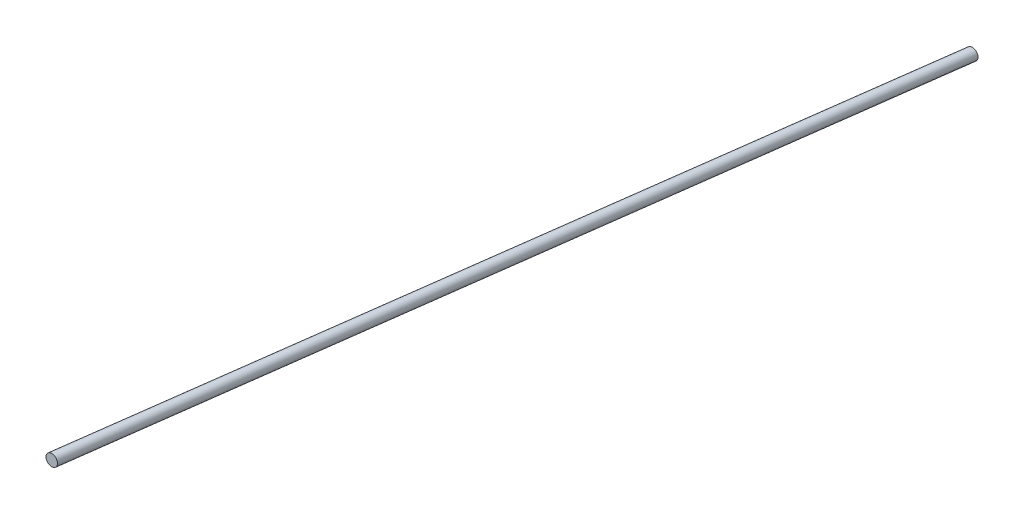
ISO-10303-21;
HEADER;
FILE_DESCRIPTION(('STEP AP214'),'2;1');
FILE_NAME('part.step','',(''),(''),'','','');
FILE_SCHEMA(('AUTOMOTIVE_DESIGN { 1 0 10303 214 1 1 1 1 }'));
ENDSEC;
DATA;
#1=APPLICATION_CONTEXT('core data for automotive mechanical design processes');
#2=APPLICATION_PROTOCOL_DEFINITION('international standard','automotive_design',2000,#1);
#3=PRODUCT_CONTEXT('',#1,'mechanical');
#4=PRODUCT('Part','Part','',(#3));
#5=PRODUCT_RELATED_PRODUCT_CATEGORY('part','',(#4));
#6=PRODUCT_DEFINITION_FORMATION('','',#4);
#7=PRODUCT_DEFINITION_CONTEXT('part definition',#1,'design');
#8=PRODUCT_DEFINITION('design','',#6,#7);
#9=PRODUCT_DEFINITION_SHAPE('','',#8);
#10=(LENGTH_UNIT() NAMED_UNIT(*) SI_UNIT(.MILLI.,.METRE.));
#11=(NAMED_UNIT(*) PLANE_ANGLE_UNIT() SI_UNIT($,.RADIAN.));
#12=(NAMED_UNIT(*) SI_UNIT($,.STERADIAN.) SOLID_ANGLE_UNIT());
#13=UNCERTAINTY_MEASURE_WITH_UNIT(LENGTH_MEASURE(1.E-05),#10,'distance_accuracy_value','');
#14=(GEOMETRIC_REPRESENTATION_CONTEXT(3) GLOBAL_UNCERTAINTY_ASSIGNED_CONTEXT((#13)) GLOBAL_UNIT_ASSIGNED_CONTEXT((#10,
#11,#12)) REPRESENTATION_CONTEXT('',''));
#15=CARTESIAN_POINT('',(0.,0.,0.));
#16=DIRECTION('',(0.,0.,1.));
#17=DIRECTION('',(1.,0.,0.));
#18=AXIS2_PLACEMENT_3D('',#15,#16,#17);
#19=CARTESIAN_POINT('',(19.1,2.1,0.));
#20=DIRECTION('',(0.,0.,-1.));
#21=DIRECTION('',(1.,0.,0.));
#22=AXIS2_PLACEMENT_3D('',#19,#20,#21);
#23=PLANE('',#22);
#24=CARTESIAN_POINT('',(19.1,2.1,0.));
#25=DIRECTION('',(0.,0.,1.));
#26=DIRECTION('',(1.,0.,0.));
#27=AXIS2_PLACEMENT_3D('',#24,#25,#26);
#28=CIRCLE('',#27,4.);
#29=CARTESIAN_POINT('',(23.1,2.1,0.));
#30=VERTEX_POINT('',#29);
#31=EDGE_CURVE('E45',#30,#30,#28,.T.);
#32=ORIENTED_EDGE('',*,*,#31,.T.);
#33=EDGE_LOOP('',(#32));
#34=FACE_BOUND('',#33,.T.);
#35=ADVANCED_FACE('F39',(#34),#23,.F.);
#36=CARTESIAN_POINT('',(94.5402780398458,2.1,-564.985632073304));
#37=DIRECTION('',(0.,0.,-1.));
#38=DIRECTION('',(1.,0.,0.));
#39=AXIS2_PLACEMENT_3D('',#36,#37,#38);
#40=PLANE('',#39);
#41=CARTESIAN_POINT('',(94.5402780398458,2.1,-564.985632073304));
#42=DIRECTION('',(0.,0.,1.));
#43=DIRECTION('',(1.,0.,0.));
#44=AXIS2_PLACEMENT_3D('',#41,#42,#43);
#45=CIRCLE('',#44,4.);
#46=CARTESIAN_POINT('',(98.5402780398458,2.1,-564.985632073304));
#47=VERTEX_POINT('',#46);
#48=EDGE_CURVE('E10',#47,#47,#45,.T.);
#49=ORIENTED_EDGE('',*,*,#48,.F.);
#50=EDGE_LOOP('',(#49));
#51=FACE_BOUND('',#50,.T.);
#52=ADVANCED_FACE('F54',(#51),#40,.T.);
#53=CARTESIAN_POINT('',(23.1,2.1,0.));
#54=CARTESIAN_POINT('',(98.5402780398458,2.1,-564.985632073304));
#55=CARTESIAN_POINT('',(23.1,10.1,0.));
#56=CARTESIAN_POINT('',(98.5402780398458,10.1,-564.985632073304));
#57=CARTESIAN_POINT('',(15.1,10.1,0.));
#58=CARTESIAN_POINT('',(90.5402780398458,10.1,-564.985632073304));
#59=CARTESIAN_POINT('',(15.1,2.1,0.));
#60=CARTESIAN_POINT('',(90.5402780398458,2.1,-564.985632073304));
#61=CARTESIAN_POINT('',(15.1,-5.9,0.));
#62=CARTESIAN_POINT('',(90.5402780398458,-5.9,-564.985632073304));
#63=CARTESIAN_POINT('',(23.1,-5.9,0.));
#64=CARTESIAN_POINT('',(98.5402780398458,-5.9,-564.985632073304));
#65=CARTESIAN_POINT('',(23.1,2.1,0.));
#66=CARTESIAN_POINT('',(98.5402780398458,2.1,-564.985632073304));
#67=(BOUNDED_SURFACE() B_SPLINE_SURFACE(3,1,((#53,#54),(#55,#56),(#57,#58),(#59,#60),(#61,#62),
(#63,#64),(#65,#66)),.UNSPECIFIED.,.T.,.F.,.F.) B_SPLINE_SURFACE_WITH_KNOTS((4,3,4),(2,2),(0.,
0.5,1.),(0.,1.),.UNSPECIFIED.) GEOMETRIC_REPRESENTATION_ITEM() RATIONAL_B_SPLINE_SURFACE(((1.,
1.),(0.333333333333333,0.333333333333333),(0.333333333333333,0.333333333333333),(1.,1.),
(0.333333333333333,0.333333333333333),(0.333333333333333,0.333333333333333),(1.,1.))) REPRESENTATION_ITEM('') SURFACE());
#68=CARTESIAN_POINT('',(98.5402780398458,2.1,-564.985632073304));
#69=CARTESIAN_POINT('',(97.7544418102641,2.1,-559.10036507254));
#70=CARTESIAN_POINT('',(96.9686055806823,2.1,-553.215098071777));
#71=CARTESIAN_POINT('',(95.3969331215189,2.1,-541.444564070249));
#72=CARTESIAN_POINT('',(94.6110968919371,2.1,-535.559297069486));
#73=CARTESIAN_POINT('',(93.0394244327737,2.1,-523.788763067959));
#74=CARTESIAN_POINT('',(92.253588203192,2.1,-517.903496067195));
#75=CARTESIAN_POINT('',(90.6819157440285,2.1,-506.132962065668));
#76=CARTESIAN_POINT('',(89.8960795144468,2.1,-500.247695064905));
#77=CARTESIAN_POINT('',(88.3244070552833,2.1,-488.477161063377));
#78=CARTESIAN_POINT('',(87.5385708257016,2.1,-482.591894062614));
#79=CARTESIAN_POINT('',(85.9668983665382,2.1,-470.821360061087));
#80=CARTESIAN_POINT('',(85.1810621369564,2.1,-464.936093060323));
#81=CARTESIAN_POINT('',(83.609389677793,2.1,-453.165559058796));
#82=CARTESIAN_POINT('',(82.8235534482113,2.1,-447.280292058032));
#83=CARTESIAN_POINT('',(81.2518809890478,2.1,-435.509758056505));
#84=CARTESIAN_POINT('',(80.4660447594661,2.1,-429.624491055741));
#85=CARTESIAN_POINT('',(78.8943723003026,2.1,-417.853957054214));
#86=CARTESIAN_POINT('',(78.1085360707209,2.1,-411.968690053451));
#87=CARTESIAN_POINT('',(76.5368636115574,2.1,-400.198156051924));
#88=CARTESIAN_POINT('',(75.7510273819757,2.1,-394.31288905116));
#89=CARTESIAN_POINT('',(74.1793549228123,2.1,-382.542355049633));
#90=CARTESIAN_POINT('',(73.3935186932305,2.1,-376.657088048869));
#91=CARTESIAN_POINT('',(71.8218462340671,2.1,-364.886554047342));
#92=CARTESIAN_POINT('',(71.0360100044853,2.1,-359.001287046579));
#93=CARTESIAN_POINT('',(69.4643375453219,2.1,-347.230753045051));
#94=CARTESIAN_POINT('',(68.6785013157402,2.1,-341.345486044288));
#95=CARTESIAN_POINT('',(67.1068288565767,2.1,-329.574952042761));
#96=CARTESIAN_POINT('',(66.320992626995,2.1,-323.689685041997));
#97=CARTESIAN_POINT('',(64.7493201678315,2.1,-311.91915104047));
#98=CARTESIAN_POINT('',(63.9634839382498,2.1,-306.033884039706));
#99=CARTESIAN_POINT('',(62.3918114790863,2.1,-294.263350038179));
#100=CARTESIAN_POINT('',(61.6059752495046,2.1,-288.378083037416));
#101=CARTESIAN_POINT('',(60.0343027903412,2.1,-276.607549035888));
#102=CARTESIAN_POINT('',(59.2484665607594,2.1,-270.722282035125));
#103=CARTESIAN_POINT('',(57.676794101596,2.1,-258.951748033598));
#104=CARTESIAN_POINT('',(56.8909578720143,2.1,-253.066481032834));
#105=CARTESIAN_POINT('',(55.3192854128508,2.1,-241.295947031307));
#106=CARTESIAN_POINT('',(54.5334491832691,2.1,-235.410680030543));
#107=CARTESIAN_POINT('',(52.9617767241056,2.1,-223.640146029016));
#108=CARTESIAN_POINT('',(52.1759404945239,2.1,-217.754879028253));
#109=CARTESIAN_POINT('',(50.6042680353604,2.1,-205.984345026725));
#110=CARTESIAN_POINT('',(49.8184318057787,2.1,-200.099078025962));
#111=CARTESIAN_POINT('',(48.2467593466153,2.1,-188.328544024435));
#112=CARTESIAN_POINT('',(47.4609231170335,2.1,-182.443277023671));
#113=CARTESIAN_POINT('',(45.8892506578701,2.1,-170.672743022144));
#114=CARTESIAN_POINT('',(45.1034144282884,2.1,-164.78747602138));
#115=CARTESIAN_POINT('',(43.5317419691249,2.1,-153.016942019853));
#116=CARTESIAN_POINT('',(42.7459057395432,2.1,-147.13167501909));
#117=CARTESIAN_POINT('',(41.1742332803797,2.1,-135.361141017562));
#118=CARTESIAN_POINT('',(40.388397050798,2.1,-129.475874016799));
#119=CARTESIAN_POINT('',(38.8167245916345,2.1,-117.705340015272));
#120=CARTESIAN_POINT('',(38.0308883620528,2.1,-111.820073014508));
#121=CARTESIAN_POINT('',(36.4592159028894,2.1,-100.049539012981));
#122=CARTESIAN_POINT('',(35.6733796733076,2.1,-94.1642720122173));
#123=CARTESIAN_POINT('',(34.1017072141442,2.1,-82.3937380106902));
#124=CARTESIAN_POINT('',(33.3158709845625,2.1,-76.5084710099266));
#125=CARTESIAN_POINT('',(31.744198525399,2.1,-64.7379370083994));
#126=CARTESIAN_POINT('',(30.9583622958173,2.1,-58.8526700076358));
#127=CARTESIAN_POINT('',(29.3866898366538,2.1,-47.0821360061087));
#128=CARTESIAN_POINT('',(28.6008536070721,2.1,-41.1968690053451));
#129=CARTESIAN_POINT('',(27.0291811479086,2.1,-29.4263350038179));
#130=CARTESIAN_POINT('',(26.2433449183269,2.1,-23.5410680030543));
#131=CARTESIAN_POINT('',(24.6716724591635,2.1,-11.7705340015272));
#132=CARTESIAN_POINT('',(23.8858362295817,2.1,-5.88526700076359));
#133=CARTESIAN_POINT('',(23.1,2.1,0.));
#134=B_SPLINE_CURVE_WITH_KNOTS('',3,(#68,#69,#70,#71,#72,#73,#74,#75,#76,#77,#78,#79,#80,#81,
#82,#83,#84,#85,#86,#87,#88,#89,#90,#91,#92,#93,#94,#95,#96,#97,#98,#99,#100,#101,#102,#103,
#104,#105,#106,#107,#108,#109,#110,#111,#112,#113,#114,#115,#116,#117,#118,#119,#120,#121,#122,
#123,#124,#125,#126,#127,#128,#129,#130,#131,#132,#133),.UNSPECIFIED.,.F.,.F.,(4,2,2,2,2,2,2,2,
2,2,2,2,2,2,2,2,2,2,2,2,2,2,2,2,2,2,2,2,2,2,2,2,4),(0.,17.8124999999999,35.625,53.4374999999999,
71.25,89.0625,106.875,124.6875,142.5,160.3125,178.125,195.9375,213.75,231.5625,249.375,267.1875,
285.,302.8125,320.625,338.4375,356.25,374.0625,391.875,409.6875,427.5,445.3125,463.125,480.9375,
498.75,516.5625,534.375,552.1875,570.),.UNSPECIFIED.);
#135=EDGE_CURVE('BSEAM52',#47,#30,#134,.T.);
#136=ORIENTED_EDGE('',*,*,#48,.T.);
#137=ORIENTED_EDGE('',*,*,#31,.F.);
#138=ORIENTED_EDGE('',*,*,#135,.T.);
#139=ORIENTED_EDGE('',*,*,#135,.F.);
#140=EDGE_LOOP('',(#136,#138,#137,#139));
#141=FACE_BOUND('',#140,.T.);
#142=ADVANCED_FACE('F52',(#141),#67,.F.);
#143=CLOSED_SHELL('',(#35,#52,#142));
#144=MANIFOLD_SOLID_BREP('B2',#143);
#145=ADVANCED_BREP_SHAPE_REPRESENTATION('',(#18,#144),#14);
#146=SHAPE_DEFINITION_REPRESENTATION(#9,#145);
ENDSEC;
END-ISO-10303-21;
